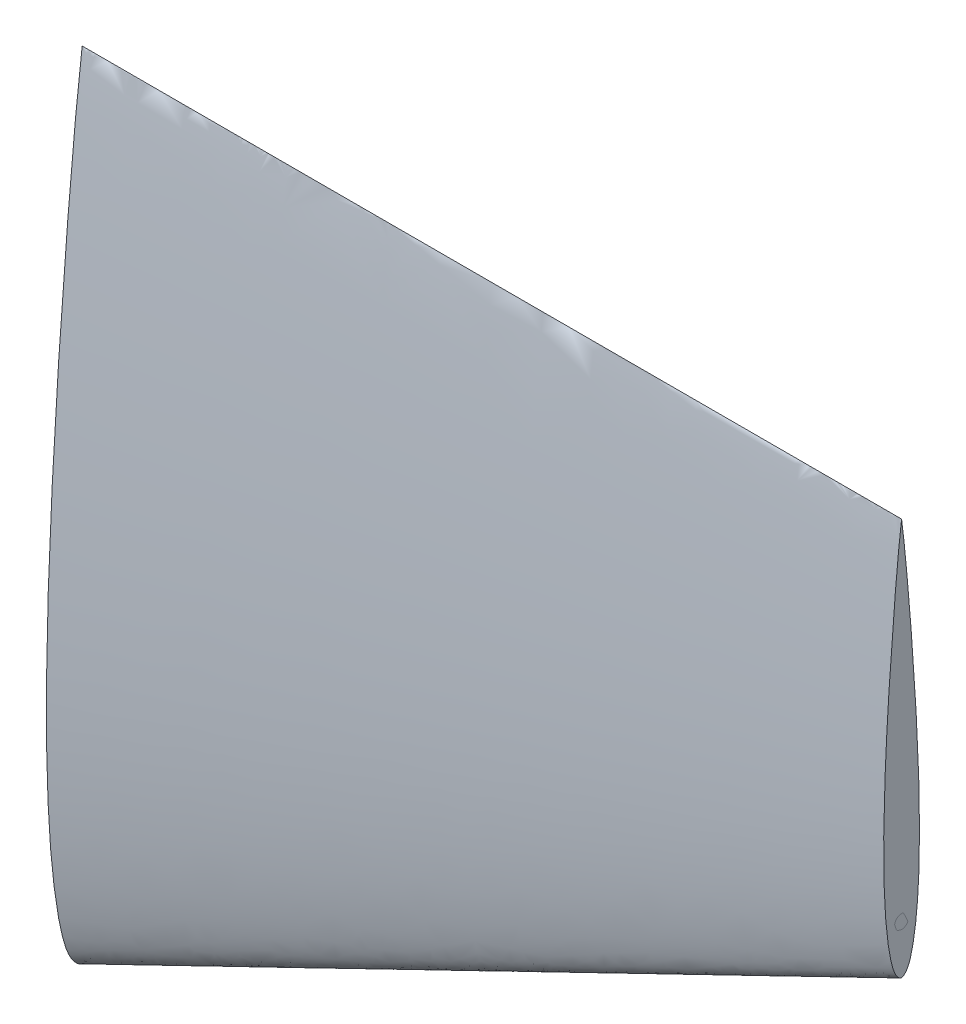
ISO-10303-21;
HEADER;
FILE_DESCRIPTION(('STEP AP214'),'2;1');
FILE_NAME('part.step','',(''),(''),'','','');
FILE_SCHEMA(('AUTOMOTIVE_DESIGN { 1 0 10303 214 1 1 1 1 }'));
ENDSEC;
DATA;
#1=APPLICATION_CONTEXT('core data for automotive mechanical design processes');
#2=APPLICATION_PROTOCOL_DEFINITION('international standard','automotive_design',2000,#1);
#3=PRODUCT_CONTEXT('',#1,'mechanical');
#4=PRODUCT('Part','Part','',(#3));
#5=PRODUCT_RELATED_PRODUCT_CATEGORY('part','',(#4));
#6=PRODUCT_DEFINITION_FORMATION('','',#4);
#7=PRODUCT_DEFINITION_CONTEXT('part definition',#1,'design');
#8=PRODUCT_DEFINITION('design','',#6,#7);
#9=PRODUCT_DEFINITION_SHAPE('','',#8);
#10=(LENGTH_UNIT() NAMED_UNIT(*) SI_UNIT(.MILLI.,.METRE.));
#11=(NAMED_UNIT(*) PLANE_ANGLE_UNIT() SI_UNIT($,.RADIAN.));
#12=(NAMED_UNIT(*) SI_UNIT($,.STERADIAN.) SOLID_ANGLE_UNIT());
#13=UNCERTAINTY_MEASURE_WITH_UNIT(LENGTH_MEASURE(1.E-05),#10,'distance_accuracy_value','');
#14=(GEOMETRIC_REPRESENTATION_CONTEXT(3) GLOBAL_UNCERTAINTY_ASSIGNED_CONTEXT((#13)) GLOBAL_UNIT_ASSIGNED_CONTEXT((#10,
#11,#12)) REPRESENTATION_CONTEXT('',''));
#15=CARTESIAN_POINT('',(0.,0.,0.));
#16=DIRECTION('',(0.,0.,1.));
#17=DIRECTION('',(1.,0.,0.));
#18=AXIS2_PLACEMENT_3D('',#15,#16,#17);
#19=CARTESIAN_POINT('',(0.,7.,0.));
#20=DIRECTION('',(-1.,0.,0.));
#21=DIRECTION('',(0.,0.,1.));
#22=AXIS2_PLACEMENT_3D('',#19,#20,#21);
#23=PLANE('',#22);
#24=CARTESIAN_POINT('',(0.,7.,0.));
#25=DIRECTION('',(-1.,0.,0.));
#26=DIRECTION('',(0.,0.,1.));
#27=AXIS2_PLACEMENT_3D('',#24,#25,#26);
#28=CIRCLE('',#27,1.);
#29=CARTESIAN_POINT('',(0.,7.,1.));
#30=VERTEX_POINT('',#29);
#31=EDGE_CURVE('E69',#30,#30,#28,.T.);
#32=ORIENTED_EDGE('',*,*,#31,.T.);
#33=EDGE_LOOP('',(#32));
#34=FACE_BOUND('',#33,.T.);
#35=ADVANCED_FACE('F62',(#34),#23,.T.);
#36=CARTESIAN_POINT('',(118.,64.2,0.));
#37=DIRECTION('',(-1.,0.,0.));
#38=DIRECTION('',(0.,0.,1.));
#39=AXIS2_PLACEMENT_3D('',#36,#37,#38);
#40=PLANE('',#39);
#41=CARTESIAN_POINT('',(118.,64.2,0.));
#42=DIRECTION('',(-1.,0.,0.));
#43=DIRECTION('',(0.,0.,1.));
#44=AXIS2_PLACEMENT_3D('',#41,#42,#43);
#45=CIRCLE('',#44,1.);
#46=CARTESIAN_POINT('',(118.,64.2,1.));
#47=VERTEX_POINT('',#46);
#48=EDGE_CURVE('E12',#47,#47,#45,.T.);
#49=ORIENTED_EDGE('',*,*,#48,.F.);
#50=EDGE_LOOP('',(#49));
#51=FACE_BOUND('',#50,.T.);
#52=ADVANCED_FACE('F79',(#51),#40,.F.);
#53=CARTESIAN_POINT('',(0.,7.,1.));
#54=CARTESIAN_POINT('',(118.,64.2,1.));
#55=CARTESIAN_POINT('',(0.,9.,1.));
#56=CARTESIAN_POINT('',(118.,66.2,1.));
#57=CARTESIAN_POINT('',(0.,9.,-1.));
#58=CARTESIAN_POINT('',(118.,66.2,-1.));
#59=CARTESIAN_POINT('',(0.,7.,-1.));
#60=CARTESIAN_POINT('',(118.,64.2,-1.));
#61=CARTESIAN_POINT('',(0.,5.,-1.));
#62=CARTESIAN_POINT('',(118.,62.2,-1.));
#63=CARTESIAN_POINT('',(0.,5.,1.));
#64=CARTESIAN_POINT('',(118.,62.2,1.));
#65=CARTESIAN_POINT('',(0.,7.,1.));
#66=CARTESIAN_POINT('',(118.,64.2,1.));
#67=(BOUNDED_SURFACE() B_SPLINE_SURFACE(3,1,((#53,#54),(#55,#56),(#57,#58),(#59,#60),(#61,#62),
(#63,#64),(#65,#66)),.UNSPECIFIED.,.T.,.F.,.F.) B_SPLINE_SURFACE_WITH_KNOTS((4,3,4),(2,2),(0.,
0.5,1.),(0.,1.),.UNSPECIFIED.) GEOMETRIC_REPRESENTATION_ITEM() RATIONAL_B_SPLINE_SURFACE(((1.,
1.),(0.333333333333333,0.333333333333333),(0.333333333333333,0.333333333333333),(1.,1.),
(0.333333333333333,0.333333333333333),(0.333333333333333,0.333333333333333),(1.,1.))) REPRESENTATION_ITEM('') SURFACE());
#68=CARTESIAN_POINT('',(118.,64.2,1.));
#69=CARTESIAN_POINT('',(116.770833333333,63.6041666666667,1.));
#70=CARTESIAN_POINT('',(115.541666666667,63.0083333333333,1.));
#71=CARTESIAN_POINT('',(113.083333333333,61.8166666666667,1.));
#72=CARTESIAN_POINT('',(111.854166666667,61.2208333333333,1.));
#73=CARTESIAN_POINT('',(109.395833333333,60.0291666666667,1.));
#74=CARTESIAN_POINT('',(108.166666666667,59.4333333333333,1.));
#75=CARTESIAN_POINT('',(105.708333333333,58.2416666666667,1.));
#76=CARTESIAN_POINT('',(104.479166666667,57.6458333333333,1.));
#77=CARTESIAN_POINT('',(102.020833333333,56.4541666666667,1.));
#78=CARTESIAN_POINT('',(100.791666666667,55.8583333333333,1.));
#79=CARTESIAN_POINT('',(98.3333333333333,54.6666666666667,1.));
#80=CARTESIAN_POINT('',(97.1041666666667,54.0708333333333,1.));
#81=CARTESIAN_POINT('',(94.6458333333333,52.8791666666667,1.));
#82=CARTESIAN_POINT('',(93.4166666666667,52.2833333333333,1.));
#83=CARTESIAN_POINT('',(90.9583333333333,51.0916666666667,1.));
#84=CARTESIAN_POINT('',(89.7291666666667,50.4958333333333,1.));
#85=CARTESIAN_POINT('',(87.2708333333333,49.3041666666667,1.));
#86=CARTESIAN_POINT('',(86.0416666666667,48.7083333333333,1.));
#87=CARTESIAN_POINT('',(83.5833333333333,47.5166666666667,1.));
#88=CARTESIAN_POINT('',(82.3541666666667,46.9208333333333,1.));
#89=CARTESIAN_POINT('',(79.8958333333333,45.7291666666667,1.));
#90=CARTESIAN_POINT('',(78.6666666666667,45.1333333333333,1.));
#91=CARTESIAN_POINT('',(76.2083333333333,43.9416666666667,1.));
#92=CARTESIAN_POINT('',(74.9791666666667,43.3458333333333,1.));
#93=CARTESIAN_POINT('',(72.5208333333333,42.1541666666667,1.));
#94=CARTESIAN_POINT('',(71.2916666666667,41.5583333333333,1.));
#95=CARTESIAN_POINT('',(68.8333333333333,40.3666666666667,1.));
#96=CARTESIAN_POINT('',(67.6041666666667,39.7708333333333,1.));
#97=CARTESIAN_POINT('',(65.1458333333333,38.5791666666667,1.));
#98=CARTESIAN_POINT('',(63.9166666666667,37.9833333333333,1.));
#99=CARTESIAN_POINT('',(61.4583333333333,36.7916666666667,1.));
#100=CARTESIAN_POINT('',(60.2291666666667,36.1958333333333,1.));
#101=CARTESIAN_POINT('',(57.7708333333333,35.0041666666667,1.));
#102=CARTESIAN_POINT('',(56.5416666666667,34.4083333333333,1.));
#103=CARTESIAN_POINT('',(54.0833333333333,33.2166666666667,1.));
#104=CARTESIAN_POINT('',(52.8541666666667,32.6208333333333,1.));
#105=CARTESIAN_POINT('',(50.3958333333333,31.4291666666667,1.));
#106=CARTESIAN_POINT('',(49.1666666666667,30.8333333333333,1.));
#107=CARTESIAN_POINT('',(46.7083333333333,29.6416666666667,1.));
#108=CARTESIAN_POINT('',(45.4791666666667,29.0458333333333,1.));
#109=CARTESIAN_POINT('',(43.0208333333333,27.8541666666667,1.));
#110=CARTESIAN_POINT('',(41.7916666666667,27.2583333333333,1.));
#111=CARTESIAN_POINT('',(39.3333333333333,26.0666666666667,1.));
#112=CARTESIAN_POINT('',(38.1041666666667,25.4708333333333,1.));
#113=CARTESIAN_POINT('',(35.6458333333333,24.2791666666667,1.));
#114=CARTESIAN_POINT('',(34.4166666666667,23.6833333333333,1.));
#115=CARTESIAN_POINT('',(31.9583333333333,22.4916666666667,1.));
#116=CARTESIAN_POINT('',(30.7291666666667,21.8958333333333,1.));
#117=CARTESIAN_POINT('',(28.2708333333333,20.7041666666667,1.));
#118=CARTESIAN_POINT('',(27.0416666666667,20.1083333333333,1.));
#119=CARTESIAN_POINT('',(24.5833333333333,18.9166666666667,1.));
#120=CARTESIAN_POINT('',(23.3541666666667,18.3208333333333,1.));
#121=CARTESIAN_POINT('',(20.8958333333333,17.1291666666667,1.));
#122=CARTESIAN_POINT('',(19.6666666666667,16.5333333333333,1.));
#123=CARTESIAN_POINT('',(17.2083333333333,15.3416666666667,1.));
#124=CARTESIAN_POINT('',(15.9791666666667,14.7458333333333,1.));
#125=CARTESIAN_POINT('',(13.5208333333333,13.5541666666667,1.));
#126=CARTESIAN_POINT('',(12.2916666666667,12.9583333333333,1.));
#127=CARTESIAN_POINT('',(9.83333333333333,11.7666666666667,1.));
#128=CARTESIAN_POINT('',(8.60416666666667,11.1708333333333,1.));
#129=CARTESIAN_POINT('',(6.14583333333333,9.97916666666667,1.));
#130=CARTESIAN_POINT('',(4.91666666666667,9.38333333333333,1.));
#131=CARTESIAN_POINT('',(2.45833333333333,8.19166666666667,1.));
#132=CARTESIAN_POINT('',(1.22916666666667,7.59583333333333,1.));
#133=CARTESIAN_POINT('',(0.,7.,1.));
#134=B_SPLINE_CURVE_WITH_KNOTS('',3,(#68,#69,#70,#71,#72,#73,#74,#75,#76,#77,#78,#79,#80,#81,
#82,#83,#84,#85,#86,#87,#88,#89,#90,#91,#92,#93,#94,#95,#96,#97,#98,#99,#100,#101,#102,#103,
#104,#105,#106,#107,#108,#109,#110,#111,#112,#113,#114,#115,#116,#117,#118,#119,#120,#121,#122,
#123,#124,#125,#126,#127,#128,#129,#130,#131,#132,#133),.UNSPECIFIED.,.F.,.F.,(4,2,2,2,2,2,2,2,
2,2,2,2,2,2,2,2,2,2,2,2,2,2,2,2,2,2,2,2,2,2,2,2,4),(0.,4.0979034273638,8.1958068547276,
12.2937102820914,16.3916137094552,20.489517136819,24.5874205641828,28.6853239915466,
32.7832274189104,36.8811308462742,40.979034273638,45.0769377010018,49.1748411283656,
53.2727445557294,57.3706479830932,61.468551410457,65.5664548378209,69.6643582651846,
73.7622616925485,77.8601651199123,81.9580685472761,86.0559719746398,90.1538754020036,
94.2517788293675,98.3496822567313,102.447585684095,106.545489111459,110.643392538823,
114.741295966186,118.83919939355,122.937102820914,127.035006248278,131.132909675642),.UNSPECIFIED.);
#135=EDGE_CURVE('BSEAM77',#47,#30,#134,.T.);
#136=ORIENTED_EDGE('',*,*,#48,.T.);
#137=ORIENTED_EDGE('',*,*,#31,.F.);
#138=ORIENTED_EDGE('',*,*,#135,.T.);
#139=ORIENTED_EDGE('',*,*,#135,.F.);
#140=EDGE_LOOP('',(#136,#138,#137,#139));
#141=FACE_BOUND('',#140,.T.);
#142=ADVANCED_FACE('F77',(#141),#67,.F.);
#143=CLOSED_SHELL('',(#35,#52,#142));
#144=MANIFOLD_SOLID_BREP('B2',#143);
#145=CARTESIAN_POINT('',(0.,114.4,0.));
#146=CARTESIAN_POINT('',(118.,114.4,0.));
#147=CARTESIAN_POINT('',(0.,114.4,0.0072838324299916));
#148=CARTESIAN_POINT('',(118.,114.4,0.0036419162149958));
#149=CARTESIAN_POINT('',(0.,114.211630690469,0.0218488366554333));
#150=CARTESIAN_POINT('',(118.,114.305815345234,0.0109244183277166));
#151=CARTESIAN_POINT('',(0.,114.080118646882,0.0436282467660752));
#152=CARTESIAN_POINT('',(118.,114.240059323441,0.0218141233830376));
#153=CARTESIAN_POINT('',(0.,113.796890954845,0.0795142857198553));
#154=CARTESIAN_POINT('',(118.,114.098445477423,0.0397571428599277));
#155=CARTESIAN_POINT('',(0.,113.426193350975,0.128529824167782));
#156=CARTESIAN_POINT('',(118.,113.913096675488,0.0642649120838911));
#157=CARTESIAN_POINT('',(0.,112.936855293923,0.189766940480201));
#158=CARTESIAN_POINT('',(118.,113.668427646962,0.0948834702401005));
#159=CARTESIAN_POINT('',(0.,112.346166999731,0.26242898975721));
#160=CARTESIAN_POINT('',(118.,113.373083499866,0.131214494878605));
#161=CARTESIAN_POINT('',(0.,110.280049707971,0.510194469718378));
#162=CARTESIAN_POINT('',(118.,112.340024853985,0.255097234859189));
#163=CARTESIAN_POINT('',(0.,105.348652112069,1.03610984584126));
#164=CARTESIAN_POINT('',(118.,109.874326056034,0.518054922920632));
#165=CARTESIAN_POINT('',(0.,98.8040196091008,1.64696029330674));
#166=CARTESIAN_POINT('',(118.,106.60200980455,0.823480146653369));
#167=CARTESIAN_POINT('',(0.,89.5887480019146,2.43856623380089));
#168=CARTESIAN_POINT('',(118.,101.994374000957,1.21928311690045));
#169=CARTESIAN_POINT('',(0.,78.5982409417213,3.29258826974691));
#170=CARTESIAN_POINT('',(118.,96.4991204708606,1.64629413487346));
#171=CARTESIAN_POINT('',(0.,64.5036725694726,4.21318410153266));
#172=CARTESIAN_POINT('',(118.,89.4518362847363,2.10659205076633));
#173=CARTESIAN_POINT('',(0.,49.9099778334894,4.91417535466658));
#174=CARTESIAN_POINT('',(118.,82.1549889167447,2.45708767733329));
#175=CARTESIAN_POINT('',(0.,38.9834810391131,5.16800984998526));
#176=CARTESIAN_POINT('',(118.,76.6917405195565,2.58400492499263));
#177=CARTESIAN_POINT('',(0.,31.9372793334657,5.15962957711146));
#178=CARTESIAN_POINT('',(118.,73.1686396667329,2.57981478855573));
#179=CARTESIAN_POINT('',(0.,28.6404540388475,5.11574905672803));
#180=CARTESIAN_POINT('',(118.,71.5202270194238,2.55787452836402));
#181=CARTESIAN_POINT('',(0.,25.4659165086855,5.03886157181797));
#182=CARTESIAN_POINT('',(118.,69.9329582543428,2.51943078590898));
#183=CARTESIAN_POINT('',(0.,21.5153111318161,4.88773266252852));
#184=CARTESIAN_POINT('',(118.,67.957655565908,2.44386633126426));
#185=CARTESIAN_POINT('',(0.,16.2443484888754,4.57614430828349));
#186=CARTESIAN_POINT('',(118.,65.3221742444377,2.28807215414175));
#187=CARTESIAN_POINT('',(0.,11.3358377518641,4.06351264731328));
#188=CARTESIAN_POINT('',(118.,62.8679188759321,2.03175632365664));
#189=CARTESIAN_POINT('',(0.,7.72888536307538,3.48002988666406));
#190=CARTESIAN_POINT('',(118.,61.0644426815377,1.74001494333203));
#191=CARTESIAN_POINT('',(0.,5.96469851713171,3.13738551279787));
#192=CARTESIAN_POINT('',(118.,60.1823492585659,1.56869275639894));
#193=CARTESIAN_POINT('',(0.,4.41708138247386,2.77256415689025));
#194=CARTESIAN_POINT('',(118.,59.4085406912369,1.38628207844513));
#195=CARTESIAN_POINT('',(0.,3.09328338163604,2.37333821699482));
#196=CARTESIAN_POINT('',(118.,58.746641690818,1.18666910849741));
#197=CARTESIAN_POINT('',(0.,1.91416621401265,1.89926931885839));
#198=CARTESIAN_POINT('',(118.,58.1570831070063,0.949634659429197));
#199=CARTESIAN_POINT('',(0.,1.05954476476886,1.39762010102772));
#200=CARTESIAN_POINT('',(118.,57.7297723823844,0.69881005051386));
#201=CARTESIAN_POINT('',(0.,0.512892322559978,0.915140017273878));
#202=CARTESIAN_POINT('',(118.,57.45644616128,0.457570008636939));
#203=CARTESIAN_POINT('',(0.,0.262612740546847,0.629628981385082));
#204=CARTESIAN_POINT('',(118.,57.3313063702734,0.314814490692541));
#205=CARTESIAN_POINT('',(0.,0.104439841482338,0.378528288285168));
#206=CARTESIAN_POINT('',(118.,57.2522199207412,0.189264144142584));
#207=CARTESIAN_POINT('',(0.,0.0187876580989688,0.186587242264394));
#208=CARTESIAN_POINT('',(118.,57.2093938290495,0.0932936211321971));
#209=CARTESIAN_POINT('',(0.,-0.00614084997411463,0.));
#210=CARTESIAN_POINT('',(118.,57.1969295750129,0.));
#211=CARTESIAN_POINT('',(0.,0.0187876580989704,-0.186587242264419));
#212=CARTESIAN_POINT('',(118.,57.2093938290495,-0.0932936211322096));
#213=CARTESIAN_POINT('',(0.,0.104439841482325,-0.378528288285144));
#214=CARTESIAN_POINT('',(118.,57.2522199207412,-0.189264144142572));
#215=CARTESIAN_POINT('',(0.,0.26261274054685,-0.629628981385088));
#216=CARTESIAN_POINT('',(118.,57.3313063702734,-0.314814490692544));
#217=CARTESIAN_POINT('',(0.,0.512892322560023,-0.915140017273927));
#218=CARTESIAN_POINT('',(118.,57.45644616128,-0.457570008636963));
#219=CARTESIAN_POINT('',(0.,1.05954476476881,-1.39762010102767));
#220=CARTESIAN_POINT('',(118.,57.7297723823844,-0.698810050513834));
#221=CARTESIAN_POINT('',(0.,1.91416621401266,-1.8992693188584));
#222=CARTESIAN_POINT('',(118.,58.1570831070064,-0.9496346594292));
#223=CARTESIAN_POINT('',(0.,3.09328338163609,-2.37333821699484));
#224=CARTESIAN_POINT('',(118.,58.746641690818,-1.18666910849742));
#225=CARTESIAN_POINT('',(0.,4.41708138247385,-2.77256415689025));
#226=CARTESIAN_POINT('',(118.,59.4085406912369,-1.38628207844513));
#227=CARTESIAN_POINT('',(0.,5.96469851713164,-3.13738551279786));
#228=CARTESIAN_POINT('',(118.,60.1823492585658,-1.56869275639893));
#229=CARTESIAN_POINT('',(0.,7.72888536307529,-3.48002988666405));
#230=CARTESIAN_POINT('',(118.,61.0644426815376,-1.74001494333202));
#231=CARTESIAN_POINT('',(0.,11.3358377518643,-4.06351264731332));
#232=CARTESIAN_POINT('',(118.,62.8679188759322,-2.03175632365666));
#233=CARTESIAN_POINT('',(0.,16.2443484888753,-4.57614430828348));
#234=CARTESIAN_POINT('',(118.,65.3221742444378,-2.28807215414174));
#235=CARTESIAN_POINT('',(0.,21.515311131816,-4.88773266252852));
#236=CARTESIAN_POINT('',(118.,67.957655565908,-2.44386633126426));
#237=CARTESIAN_POINT('',(0.,25.4659165086855,-5.03886157181797));
#238=CARTESIAN_POINT('',(118.,69.9329582543428,-2.51943078590898));
#239=CARTESIAN_POINT('',(0.,28.6404540388475,-5.11574905672804));
#240=CARTESIAN_POINT('',(118.,71.5202270194237,-2.55787452836402));
#241=CARTESIAN_POINT('',(0.,31.9372793334656,-5.15962957711145));
#242=CARTESIAN_POINT('',(118.,73.1686396667328,-2.57981478855572));
#243=CARTESIAN_POINT('',(0.,38.9834810391131,-5.16800984998528));
#244=CARTESIAN_POINT('',(118.,76.6917405195565,-2.58400492499264));
#245=CARTESIAN_POINT('',(0.,49.9099778334897,-4.91417535466658));
#246=CARTESIAN_POINT('',(118.,82.1549889167448,-2.45708767733329));
#247=CARTESIAN_POINT('',(0.,64.5036725694725,-4.21318410153266));
#248=CARTESIAN_POINT('',(118.,89.4518362847363,-2.10659205076633));
#249=CARTESIAN_POINT('',(0.,78.5982409417211,-3.29258826974692));
#250=CARTESIAN_POINT('',(118.,96.4991204708607,-1.64629413487346));
#251=CARTESIAN_POINT('',(0.,89.5887480019146,-2.43856623380088));
#252=CARTESIAN_POINT('',(118.,101.994374000957,-1.21928311690044));
#253=CARTESIAN_POINT('',(0.,98.8040196091008,-1.64696029330675));
#254=CARTESIAN_POINT('',(118.,106.60200980455,-0.823480146653373));
#255=CARTESIAN_POINT('',(0.,105.348652112069,-1.03610984584126));
#256=CARTESIAN_POINT('',(118.,109.874326056035,-0.51805492292063));
#257=CARTESIAN_POINT('',(0.,110.280049707971,-0.510194469718387));
#258=CARTESIAN_POINT('',(118.,112.340024853985,-0.255097234859193));
#259=CARTESIAN_POINT('',(0.,112.346166999731,-0.262428989757209));
#260=CARTESIAN_POINT('',(118.,113.373083499866,-0.131214494878604));
#261=CARTESIAN_POINT('',(0.,112.936855293923,-0.189766940480202));
#262=CARTESIAN_POINT('',(118.,113.668427646961,-0.0948834702401012));
#263=CARTESIAN_POINT('',(0.,113.426193350975,-0.12852982416778));
#264=CARTESIAN_POINT('',(118.,113.913096675488,-0.0642649120838899));
#265=CARTESIAN_POINT('',(0.,113.796890954845,-0.0795142857198586));
#266=CARTESIAN_POINT('',(118.,114.098445477423,-0.0397571428599293));
#267=CARTESIAN_POINT('',(0.,114.080118646882,-0.043628246766073));
#268=CARTESIAN_POINT('',(118.,114.240059323441,-0.0218141233830365));
#269=CARTESIAN_POINT('',(0.,114.211630690469,-0.0218488366554367));
#270=CARTESIAN_POINT('',(118.,114.305815345234,-0.0109244183277184));
#271=CARTESIAN_POINT('',(0.,114.4,-0.00728383242999128));
#272=CARTESIAN_POINT('',(118.,114.4,-0.00364191621499564));
#273=CARTESIAN_POINT('',(0.,114.4,0.));
#274=CARTESIAN_POINT('',(118.,114.4,0.));
#275=B_SPLINE_SURFACE_WITH_KNOTS('',3,1,((#145,#146),(#147,#148),(#149,#150),(#151,#152),(#153,
#154),(#155,#156),(#157,#158),(#159,#160),(#161,#162),(#163,#164),(#165,#166),(#167,#168),(#169,
#170),(#171,#172),(#173,#174),(#175,#176),(#177,#178),(#179,#180),(#181,#182),(#183,#184),(#185,
#186),(#187,#188),(#189,#190),(#191,#192),(#193,#194),(#195,#196),(#197,#198),(#199,#200),(#201,
#202),(#203,#204),(#205,#206),(#207,#208),(#209,#210),(#211,#212),(#213,#214),(#215,#216),(#217,
#218),(#219,#220),(#221,#222),(#223,#224),(#225,#226),(#227,#228),(#229,#230),(#231,#232),(#233,
#234),(#235,#236),(#237,#238),(#239,#240),(#241,#242),(#243,#244),(#245,#246),(#247,#248),(#249,
#250),(#251,#252),(#253,#254),(#255,#256),(#257,#258),(#259,#260),(#261,#262),(#263,#264),(#265,
#266),(#267,#268),(#269,#270),(#271,#272),(#273,#274)),.UNSPECIFIED.,.T.,.F.,.F.,(4,1,1,1,1,1,1,
1,1,1,1,1,1,1,1,1,1,1,1,1,1,1,1,1,1,1,1,1,1,1,1,1,1,1,1,1,1,1,1,1,1,1,1,1,1,1,1,1,1,1,1,1,1,1,1,
1,1,1,1,1,1,1,4),(2,2),(0.,0.000711185839146075,0.00142211189669677,0.00213325230730564,
0.00425158120835251,0.00636919832710723,0.00848752581630524,0.0119730784810977,
0.0333165732602391,0.072750532853801,0.097133324863051,0.153150736130299,0.215572756141474,
0.280129489501461,0.342436877180773,0.35716003719228,0.371419982611637,0.385154319352995,
0.398301185339692,0.422640862362832,0.453555830037826,0.462206438132531,0.469975829256052,
0.476836911130722,0.482800105251618,0.487877314409996,0.493276037135274,0.495568649395588,
0.497302284253286,0.498179926351266,0.499405098860122,0.5,0.500594901139878,0.501820073648735,
0.502697715746714,0.504431350604412,0.506723962864726,0.512122685590004,0.517199894748382,
0.523163088869278,0.530024170743948,0.537793561867469,0.546444169962174,0.577359137637168,
0.601698814660308,0.614845680647005,0.628580017388363,0.64283996280772,0.657563122819227,
0.719870510498539,0.784427243858526,0.846849263869701,0.902866675136949,0.927249467146199,
0.966683426739761,0.988026921518902,0.991512474183695,0.993630801672893,0.995748418791648,
0.997866747692695,0.998577888103303,0.999288814160854,1.),(0.,1.),.UNSPECIFIED.);
#276=CARTESIAN_POINT('',(0.,114.4,0.));
#277=CARTESIAN_POINT('',(0.,114.4,0.0072838324299916));
#278=CARTESIAN_POINT('',(0.,114.211630690469,0.0218488366554333));
#279=CARTESIAN_POINT('',(0.,114.080118646882,0.0436282467660752));
#280=CARTESIAN_POINT('',(0.,113.796890954845,0.0795142857198553));
#281=CARTESIAN_POINT('',(0.,113.426193350975,0.128529824167782));
#282=CARTESIAN_POINT('',(0.,112.936855293923,0.189766940480201));
#283=CARTESIAN_POINT('',(0.,112.346166999731,0.26242898975721));
#284=CARTESIAN_POINT('',(0.,110.280049707971,0.510194469718378));
#285=CARTESIAN_POINT('',(0.,105.348652112069,1.03610984584126));
#286=CARTESIAN_POINT('',(0.,98.8040196091008,1.64696029330674));
#287=CARTESIAN_POINT('',(0.,89.5887480019146,2.43856623380089));
#288=CARTESIAN_POINT('',(0.,78.5982409417213,3.29258826974691));
#289=CARTESIAN_POINT('',(0.,64.5036725694726,4.21318410153266));
#290=CARTESIAN_POINT('',(0.,49.9099778334894,4.91417535466658));
#291=CARTESIAN_POINT('',(0.,38.9834810391131,5.16800984998526));
#292=CARTESIAN_POINT('',(0.,31.9372793334657,5.15962957711146));
#293=CARTESIAN_POINT('',(0.,28.6404540388475,5.11574905672803));
#294=CARTESIAN_POINT('',(0.,25.4659165086855,5.03886157181797));
#295=CARTESIAN_POINT('',(0.,21.5153111318161,4.88773266252852));
#296=CARTESIAN_POINT('',(0.,16.2443484888754,4.57614430828349));
#297=CARTESIAN_POINT('',(0.,11.3358377518641,4.06351264731328));
#298=CARTESIAN_POINT('',(0.,7.72888536307538,3.48002988666406));
#299=CARTESIAN_POINT('',(0.,5.96469851713171,3.13738551279787));
#300=CARTESIAN_POINT('',(0.,4.41708138247386,2.77256415689025));
#301=CARTESIAN_POINT('',(0.,3.09328338163604,2.37333821699482));
#302=CARTESIAN_POINT('',(0.,1.91416621401265,1.89926931885839));
#303=CARTESIAN_POINT('',(0.,1.05954476476886,1.39762010102772));
#304=CARTESIAN_POINT('',(0.,0.512892322559978,0.915140017273878));
#305=CARTESIAN_POINT('',(0.,0.262612740546847,0.629628981385082));
#306=CARTESIAN_POINT('',(0.,0.104439841482338,0.378528288285168));
#307=CARTESIAN_POINT('',(0.,0.0187876580989688,0.186587242264394));
#308=CARTESIAN_POINT('',(0.,-0.00614084997411463,0.));
#309=CARTESIAN_POINT('',(0.,0.0187876580989704,-0.186587242264419));
#310=CARTESIAN_POINT('',(0.,0.104439841482325,-0.378528288285144));
#311=CARTESIAN_POINT('',(0.,0.26261274054685,-0.629628981385088));
#312=CARTESIAN_POINT('',(0.,0.512892322560023,-0.915140017273927));
#313=CARTESIAN_POINT('',(0.,1.05954476476881,-1.39762010102767));
#314=CARTESIAN_POINT('',(0.,1.91416621401266,-1.8992693188584));
#315=CARTESIAN_POINT('',(0.,3.09328338163609,-2.37333821699484));
#316=CARTESIAN_POINT('',(0.,4.41708138247385,-2.77256415689025));
#317=CARTESIAN_POINT('',(0.,5.96469851713164,-3.13738551279786));
#318=CARTESIAN_POINT('',(0.,7.72888536307529,-3.48002988666405));
#319=CARTESIAN_POINT('',(0.,11.3358377518643,-4.06351264731332));
#320=CARTESIAN_POINT('',(0.,16.2443484888753,-4.57614430828348));
#321=CARTESIAN_POINT('',(0.,21.515311131816,-4.88773266252852));
#322=CARTESIAN_POINT('',(0.,25.4659165086855,-5.03886157181797));
#323=CARTESIAN_POINT('',(0.,28.6404540388475,-5.11574905672804));
#324=CARTESIAN_POINT('',(0.,31.9372793334656,-5.15962957711145));
#325=CARTESIAN_POINT('',(0.,38.9834810391131,-5.16800984998528));
#326=CARTESIAN_POINT('',(0.,49.9099778334897,-4.91417535466658));
#327=CARTESIAN_POINT('',(0.,64.5036725694725,-4.21318410153266));
#328=CARTESIAN_POINT('',(0.,78.5982409417211,-3.29258826974692));
#329=CARTESIAN_POINT('',(0.,89.5887480019146,-2.43856623380088));
#330=CARTESIAN_POINT('',(0.,98.8040196091008,-1.64696029330675));
#331=CARTESIAN_POINT('',(0.,105.348652112069,-1.03610984584126));
#332=CARTESIAN_POINT('',(0.,110.280049707971,-0.510194469718387));
#333=CARTESIAN_POINT('',(0.,112.346166999731,-0.262428989757209));
#334=CARTESIAN_POINT('',(0.,112.936855293923,-0.189766940480202));
#335=CARTESIAN_POINT('',(0.,113.426193350975,-0.12852982416778));
#336=CARTESIAN_POINT('',(0.,113.796890954845,-0.0795142857198586));
#337=CARTESIAN_POINT('',(0.,114.080118646882,-0.043628246766073));
#338=CARTESIAN_POINT('',(0.,114.211630690469,-0.0218488366554367));
#339=CARTESIAN_POINT('',(0.,114.4,-0.00728383242999128));
#340=CARTESIAN_POINT('',(0.,114.4,0.));
#341=B_SPLINE_CURVE_WITH_KNOTS('',3,(#276,#277,#278,#279,#280,#281,#282,#283,#284,#285,#286,
#287,#288,#289,#290,#291,#292,#293,#294,#295,#296,#297,#298,#299,#300,#301,#302,#303,#304,#305,
#306,#307,#308,#309,#310,#311,#312,#313,#314,#315,#316,#317,#318,#319,#320,#321,#322,#323,#324,
#325,#326,#327,#328,#329,#330,#331,#332,#333,#334,#335,#336,#337,#338,#339,#340),.UNSPECIFIED.,
.T.,.F.,(4,1,1,1,1,1,1,1,1,1,1,1,1,1,1,1,1,1,1,1,1,1,1,1,1,1,1,1,1,1,1,1,1,1,1,1,1,1,1,1,1,1,1,
1,1,1,1,1,1,1,1,1,1,1,1,1,1,1,1,1,1,1,4),(0.,0.000711185839146075,0.00142211189669677,
0.00213325230730564,0.00425158120835251,0.00636919832710723,0.00848752581630524,
0.0119730784810977,0.0333165732602391,0.072750532853801,0.097133324863051,0.153150736130299,
0.215572756141474,0.280129489501461,0.342436877180773,0.35716003719228,0.371419982611637,
0.385154319352995,0.398301185339692,0.422640862362832,0.453555830037826,0.462206438132531,
0.469975829256052,0.476836911130722,0.482800105251618,0.487877314409996,0.493276037135274,
0.495568649395588,0.497302284253286,0.498179926351266,0.499405098860122,0.5,0.500594901139878,
0.501820073648735,0.502697715746714,0.504431350604412,0.506723962864726,0.512122685590004,
0.517199894748382,0.523163088869278,0.530024170743948,0.537793561867469,0.546444169962174,
0.577359137637168,0.601698814660308,0.614845680647005,0.628580017388363,0.64283996280772,
0.657563122819227,0.719870510498539,0.784427243858526,0.846849263869701,0.902866675136949,
0.927249467146199,0.966683426739761,0.988026921518902,0.991512474183695,0.993630801672893,
0.995748418791648,0.997866747692695,0.998577888103303,0.999288814160854,1.),.UNSPECIFIED.);
#342=CARTESIAN_POINT('',(0.,114.4,0.));
#343=VERTEX_POINT('',#342);
#344=EDGE_CURVE('E61',#343,#343,#341,.T.);
#345=CARTESIAN_POINT('',(118.,114.4,0.));
#346=CARTESIAN_POINT('',(118.,114.4,0.0036419162149958));
#347=CARTESIAN_POINT('',(118.,114.305815345234,0.0109244183277166));
#348=CARTESIAN_POINT('',(118.,114.240059323441,0.0218141233830376));
#349=CARTESIAN_POINT('',(118.,114.098445477423,0.0397571428599277));
#350=CARTESIAN_POINT('',(118.,113.913096675488,0.0642649120838911));
#351=CARTESIAN_POINT('',(118.,113.668427646962,0.0948834702401005));
#352=CARTESIAN_POINT('',(118.,113.373083499866,0.131214494878605));
#353=CARTESIAN_POINT('',(118.,112.340024853985,0.255097234859189));
#354=CARTESIAN_POINT('',(118.,109.874326056034,0.518054922920632));
#355=CARTESIAN_POINT('',(118.,106.60200980455,0.823480146653369));
#356=CARTESIAN_POINT('',(118.,101.994374000957,1.21928311690045));
#357=CARTESIAN_POINT('',(118.,96.4991204708606,1.64629413487346));
#358=CARTESIAN_POINT('',(118.,89.4518362847363,2.10659205076633));
#359=CARTESIAN_POINT('',(118.,82.1549889167447,2.45708767733329));
#360=CARTESIAN_POINT('',(118.,76.6917405195565,2.58400492499263));
#361=CARTESIAN_POINT('',(118.,73.1686396667329,2.57981478855573));
#362=CARTESIAN_POINT('',(118.,71.5202270194238,2.55787452836402));
#363=CARTESIAN_POINT('',(118.,69.9329582543428,2.51943078590898));
#364=CARTESIAN_POINT('',(118.,67.957655565908,2.44386633126426));
#365=CARTESIAN_POINT('',(118.,65.3221742444377,2.28807215414175));
#366=CARTESIAN_POINT('',(118.,62.8679188759321,2.03175632365664));
#367=CARTESIAN_POINT('',(118.,61.0644426815377,1.74001494333203));
#368=CARTESIAN_POINT('',(118.,60.1823492585659,1.56869275639894));
#369=CARTESIAN_POINT('',(118.,59.4085406912369,1.38628207844513));
#370=CARTESIAN_POINT('',(118.,58.746641690818,1.18666910849741));
#371=CARTESIAN_POINT('',(118.,58.1570831070063,0.949634659429197));
#372=CARTESIAN_POINT('',(118.,57.7297723823844,0.69881005051386));
#373=CARTESIAN_POINT('',(118.,57.45644616128,0.457570008636939));
#374=CARTESIAN_POINT('',(118.,57.3313063702734,0.314814490692541));
#375=CARTESIAN_POINT('',(118.,57.2522199207412,0.189264144142584));
#376=CARTESIAN_POINT('',(118.,57.2093938290495,0.0932936211321971));
#377=CARTESIAN_POINT('',(118.,57.1969295750129,0.));
#378=CARTESIAN_POINT('',(118.,57.2093938290495,-0.0932936211322096));
#379=CARTESIAN_POINT('',(118.,57.2522199207412,-0.189264144142572));
#380=CARTESIAN_POINT('',(118.,57.3313063702734,-0.314814490692544));
#381=CARTESIAN_POINT('',(118.,57.45644616128,-0.457570008636963));
#382=CARTESIAN_POINT('',(118.,57.7297723823844,-0.698810050513834));
#383=CARTESIAN_POINT('',(118.,58.1570831070064,-0.9496346594292));
#384=CARTESIAN_POINT('',(118.,58.746641690818,-1.18666910849742));
#385=CARTESIAN_POINT('',(118.,59.4085406912369,-1.38628207844513));
#386=CARTESIAN_POINT('',(118.,60.1823492585658,-1.56869275639893));
#387=CARTESIAN_POINT('',(118.,61.0644426815376,-1.74001494333202));
#388=CARTESIAN_POINT('',(118.,62.8679188759322,-2.03175632365666));
#389=CARTESIAN_POINT('',(118.,65.3221742444378,-2.28807215414174));
#390=CARTESIAN_POINT('',(118.,67.957655565908,-2.44386633126426));
#391=CARTESIAN_POINT('',(118.,69.9329582543428,-2.51943078590898));
#392=CARTESIAN_POINT('',(118.,71.5202270194237,-2.55787452836402));
#393=CARTESIAN_POINT('',(118.,73.1686396667328,-2.57981478855572));
#394=CARTESIAN_POINT('',(118.,76.6917405195565,-2.58400492499264));
#395=CARTESIAN_POINT('',(118.,82.1549889167448,-2.45708767733329));
#396=CARTESIAN_POINT('',(118.,89.4518362847363,-2.10659205076633));
#397=CARTESIAN_POINT('',(118.,96.4991204708607,-1.64629413487346));
#398=CARTESIAN_POINT('',(118.,101.994374000957,-1.21928311690044));
#399=CARTESIAN_POINT('',(118.,106.60200980455,-0.823480146653373));
#400=CARTESIAN_POINT('',(118.,109.874326056035,-0.51805492292063));
#401=CARTESIAN_POINT('',(118.,112.340024853985,-0.255097234859193));
#402=CARTESIAN_POINT('',(118.,113.373083499866,-0.131214494878604));
#403=CARTESIAN_POINT('',(118.,113.668427646961,-0.0948834702401012));
#404=CARTESIAN_POINT('',(118.,113.913096675488,-0.0642649120838899));
#405=CARTESIAN_POINT('',(118.,114.098445477423,-0.0397571428599293));
#406=CARTESIAN_POINT('',(118.,114.240059323441,-0.0218141233830365));
#407=CARTESIAN_POINT('',(118.,114.305815345234,-0.0109244183277184));
#408=CARTESIAN_POINT('',(118.,114.4,-0.00364191621499564));
#409=CARTESIAN_POINT('',(118.,114.4,0.));
#410=B_SPLINE_CURVE_WITH_KNOTS('',3,(#345,#346,#347,#348,#349,#350,#351,#352,#353,#354,#355,
#356,#357,#358,#359,#360,#361,#362,#363,#364,#365,#366,#367,#368,#369,#370,#371,#372,#373,#374,
#375,#376,#377,#378,#379,#380,#381,#382,#383,#384,#385,#386,#387,#388,#389,#390,#391,#392,#393,
#394,#395,#396,#397,#398,#399,#400,#401,#402,#403,#404,#405,#406,#407,#408,#409),.UNSPECIFIED.,
.T.,.F.,(4,1,1,1,1,1,1,1,1,1,1,1,1,1,1,1,1,1,1,1,1,1,1,1,1,1,1,1,1,1,1,1,1,1,1,1,1,1,1,1,1,1,1,
1,1,1,1,1,1,1,1,1,1,1,1,1,1,1,1,1,1,1,4),(0.,0.000711185839146075,0.00142211189669677,
0.00213325230730564,0.00425158120835251,0.00636919832710723,0.00848752581630524,
0.0119730784810977,0.0333165732602391,0.072750532853801,0.097133324863051,0.153150736130299,
0.215572756141474,0.280129489501461,0.342436877180773,0.35716003719228,0.371419982611637,
0.385154319352995,0.398301185339692,0.422640862362832,0.453555830037826,0.462206438132531,
0.469975829256052,0.476836911130722,0.482800105251618,0.487877314409996,0.493276037135274,
0.495568649395588,0.497302284253286,0.498179926351266,0.499405098860122,0.5,0.500594901139878,
0.501820073648735,0.502697715746714,0.504431350604412,0.506723962864726,0.512122685590004,
0.517199894748382,0.523163088869278,0.530024170743948,0.537793561867469,0.546444169962174,
0.577359137637168,0.601698814660308,0.614845680647005,0.628580017388363,0.64283996280772,
0.657563122819227,0.719870510498539,0.784427243858526,0.846849263869701,0.902866675136949,
0.927249467146199,0.966683426739761,0.988026921518902,0.991512474183695,0.993630801672893,
0.995748418791648,0.997866747692695,0.998577888103303,0.999288814160854,1.),.UNSPECIFIED.);
#411=CARTESIAN_POINT('',(118.,114.4,0.));
#412=VERTEX_POINT('',#411);
#413=EDGE_CURVE('E122',#412,#412,#410,.T.);
#414=ORIENTED_EDGE('',*,*,#344,.T.);
#415=EDGE_LOOP('',(#414));
#416=FACE_BOUND('',#415,.T.);
#417=ORIENTED_EDGE('',*,*,#413,.F.);
#418=EDGE_LOOP('',(#417));
#419=FACE_BOUND('',#418,.T.);
#420=ADVANCED_FACE('F118',(#416,#419),#275,.T.);
#421=CARTESIAN_POINT('',(0.,0.,0.));
#422=DIRECTION('',(-1.,0.,0.));
#423=DIRECTION('',(0.,0.,1.));
#424=AXIS2_PLACEMENT_3D('',#421,#422,#423);
#425=PLANE('',#424);
#426=ORIENTED_EDGE('',*,*,#344,.F.);
#427=EDGE_LOOP('',(#426));
#428=FACE_BOUND('',#427,.T.);
#429=ADVANCED_FACE('F142',(#428),#425,.T.);
#430=CARTESIAN_POINT('',(118.,57.2,0.));
#431=DIRECTION('',(-1.,0.,0.));
#432=DIRECTION('',(0.,0.,1.));
#433=AXIS2_PLACEMENT_3D('',#430,#431,#432);
#434=PLANE('',#433);
#435=ORIENTED_EDGE('',*,*,#413,.T.);
#436=EDGE_LOOP('',(#435));
#437=FACE_BOUND('',#436,.T.);
#438=ADVANCED_FACE('F120',(#437),#434,.F.);
#439=CLOSED_SHELL('',(#420,#429,#438));
#440=MANIFOLD_SOLID_BREP('B7_NOT_SHOWN',#439);
#441=ADVANCED_BREP_SHAPE_REPRESENTATION('',(#18,#144,#440),#14);
#442=SHAPE_DEFINITION_REPRESENTATION(#9,#441);
ENDSEC;
END-ISO-10303-21;
